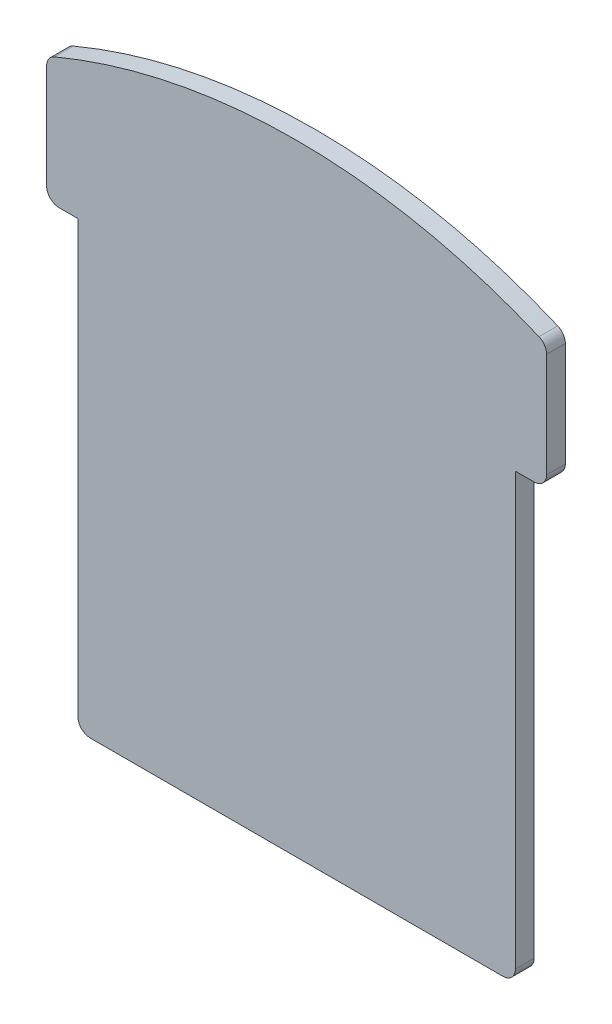
ISO-10303-21;
HEADER;
FILE_DESCRIPTION(('STEP AP214'),'2;1');
FILE_NAME('part.step','',(''),(''),'','','');
FILE_SCHEMA(('AUTOMOTIVE_DESIGN { 1 0 10303 214 1 1 1 1 }'));
ENDSEC;
DATA;
#1=APPLICATION_CONTEXT('core data for automotive mechanical design processes');
#2=APPLICATION_PROTOCOL_DEFINITION('international standard','automotive_design',2000,#1);
#3=PRODUCT_CONTEXT('',#1,'mechanical');
#4=PRODUCT('Part','Part','',(#3));
#5=PRODUCT_RELATED_PRODUCT_CATEGORY('part','',(#4));
#6=PRODUCT_DEFINITION_FORMATION('','',#4);
#7=PRODUCT_DEFINITION_CONTEXT('part definition',#1,'design');
#8=PRODUCT_DEFINITION('design','',#6,#7);
#9=PRODUCT_DEFINITION_SHAPE('','',#8);
#10=(LENGTH_UNIT() NAMED_UNIT(*) SI_UNIT(.MILLI.,.METRE.));
#11=(NAMED_UNIT(*) PLANE_ANGLE_UNIT() SI_UNIT($,.RADIAN.));
#12=(NAMED_UNIT(*) SI_UNIT($,.STERADIAN.) SOLID_ANGLE_UNIT());
#13=UNCERTAINTY_MEASURE_WITH_UNIT(LENGTH_MEASURE(1.E-05),#10,'distance_accuracy_value','');
#14=(GEOMETRIC_REPRESENTATION_CONTEXT(3) GLOBAL_UNCERTAINTY_ASSIGNED_CONTEXT((#13)) GLOBAL_UNIT_ASSIGNED_CONTEXT((#10,
#11,#12)) REPRESENTATION_CONTEXT('',''));
#15=CARTESIAN_POINT('',(0.,0.,0.));
#16=DIRECTION('',(0.,0.,1.));
#17=DIRECTION('',(1.,0.,0.));
#18=AXIS2_PLACEMENT_3D('',#15,#16,#17);
#19=CARTESIAN_POINT('',(0.,0.,3.));
#20=DIRECTION('',(1.,0.,0.));
#21=DIRECTION('',(0.,0.,-1.));
#22=AXIS2_PLACEMENT_3D('',#19,#20,#21);
#23=PLANE('',#22);
#24=DIRECTION('',(0.,-1.,0.));
#25=VECTOR('',#24,1.);
#26=CARTESIAN_POINT('',(0.,0.,0.));
#27=LINE('',#26,#25);
#28=CARTESIAN_POINT('',(0.,71.,0.));
#29=VERTEX_POINT('',#28);
#30=CARTESIAN_POINT('',(0.,2.,0.));
#31=VERTEX_POINT('',#30);
#32=EDGE_CURVE('E187',#29,#31,#27,.T.);
#33=ORIENTED_EDGE('',*,*,#32,.T.);
#34=DIRECTION('',(0.,0.,-1.));
#35=VECTOR('',#34,1.);
#36=CARTESIAN_POINT('',(0.,2.,3.));
#37=LINE('',#36,#35);
#38=CARTESIAN_POINT('',(0.,2.,3.));
#39=VERTEX_POINT('',#38);
#40=EDGE_CURVE('E282',#31,#39,#37,.F.);
#41=ORIENTED_EDGE('',*,*,#40,.T.);
#42=DIRECTION('',(0.,-1.,0.));
#43=VECTOR('',#42,1.);
#44=CARTESIAN_POINT('',(0.,0.,3.));
#45=LINE('',#44,#43);
#46=CARTESIAN_POINT('',(0.,71.,3.));
#47=VERTEX_POINT('',#46);
#48=EDGE_CURVE('E152',#47,#39,#45,.T.);
#49=ORIENTED_EDGE('',*,*,#48,.F.);
#50=DIRECTION('',(0.,0.,-1.));
#51=VECTOR('',#50,1.);
#52=CARTESIAN_POINT('',(0.,71.,3.));
#53=LINE('',#52,#51);
#54=EDGE_CURVE('E165',#47,#29,#53,.T.);
#55=ORIENTED_EDGE('',*,*,#54,.T.);
#56=EDGE_LOOP('',(#33,#41,#49,#55));
#57=FACE_BOUND('',#56,.T.);
#58=ADVANCED_FACE('F39',(#57),#23,.F.);
#59=CARTESIAN_POINT('',(0.,0.,3.));
#60=DIRECTION('',(0.,1.,0.));
#61=DIRECTION('',(0.,0.,1.));
#62=AXIS2_PLACEMENT_3D('',#59,#60,#61);
#63=PLANE('',#62);
#64=DIRECTION('',(1.,0.,0.));
#65=VECTOR('',#64,1.);
#66=CARTESIAN_POINT('',(0.,0.,0.));
#67=LINE('',#66,#65);
#68=CARTESIAN_POINT('',(2.,0.,0.));
#69=VERTEX_POINT('',#68);
#70=CARTESIAN_POINT('',(68.,0.,0.));
#71=VERTEX_POINT('',#70);
#72=EDGE_CURVE('E153',#69,#71,#67,.T.);
#73=ORIENTED_EDGE('',*,*,#72,.T.);
#74=DIRECTION('',(0.,0.,-1.));
#75=VECTOR('',#74,1.);
#76=CARTESIAN_POINT('',(68.,0.,3.));
#77=LINE('',#76,#75);
#78=CARTESIAN_POINT('',(68.,0.,3.));
#79=VERTEX_POINT('',#78);
#80=EDGE_CURVE('E279',#71,#79,#77,.F.);
#81=ORIENTED_EDGE('',*,*,#80,.T.);
#82=DIRECTION('',(1.,0.,0.));
#83=VECTOR('',#82,1.);
#84=CARTESIAN_POINT('',(0.,0.,3.));
#85=LINE('',#84,#83);
#86=CARTESIAN_POINT('',(2.,0.,3.));
#87=VERTEX_POINT('',#86);
#88=EDGE_CURVE('E206',#87,#79,#85,.T.);
#89=ORIENTED_EDGE('',*,*,#88,.F.);
#90=DIRECTION('',(0.,0.,-1.));
#91=VECTOR('',#90,1.);
#92=CARTESIAN_POINT('',(2.,0.,3.));
#93=LINE('',#92,#91);
#94=EDGE_CURVE('E276',#87,#69,#93,.T.);
#95=ORIENTED_EDGE('',*,*,#94,.T.);
#96=EDGE_LOOP('',(#73,#81,#89,#95));
#97=FACE_BOUND('',#96,.T.);
#98=ADVANCED_FACE('F320',(#97),#63,.F.);
#99=CARTESIAN_POINT('',(70.,0.,3.));
#100=DIRECTION('',(-1.,0.,0.));
#101=DIRECTION('',(0.,0.,1.));
#102=AXIS2_PLACEMENT_3D('',#99,#100,#101);
#103=PLANE('',#102);
#104=DIRECTION('',(0.,1.,0.));
#105=VECTOR('',#104,1.);
#106=CARTESIAN_POINT('',(70.,0.,3.));
#107=LINE('',#106,#105);
#108=CARTESIAN_POINT('',(70.,2.,3.));
#109=VERTEX_POINT('',#108);
#110=CARTESIAN_POINT('',(70.,71.,3.));
#111=VERTEX_POINT('',#110);
#112=EDGE_CURVE('E210',#109,#111,#107,.T.);
#113=ORIENTED_EDGE('',*,*,#112,.F.);
#114=DIRECTION('',(0.,0.,-1.));
#115=VECTOR('',#114,1.);
#116=CARTESIAN_POINT('',(70.,2.,3.));
#117=LINE('',#116,#115);
#118=CARTESIAN_POINT('',(70.,2.,0.));
#119=VERTEX_POINT('',#118);
#120=EDGE_CURVE('E149',#109,#119,#117,.T.);
#121=ORIENTED_EDGE('',*,*,#120,.T.);
#122=DIRECTION('',(0.,1.,0.));
#123=VECTOR('',#122,1.);
#124=CARTESIAN_POINT('',(70.,0.,0.));
#125=LINE('',#124,#123);
#126=CARTESIAN_POINT('',(70.,71.,0.));
#127=VERTEX_POINT('',#126);
#128=EDGE_CURVE('E142',#119,#127,#125,.T.);
#129=ORIENTED_EDGE('',*,*,#128,.T.);
#130=DIRECTION('',(0.,0.,-1.));
#131=VECTOR('',#130,1.);
#132=CARTESIAN_POINT('',(70.,71.,3.));
#133=LINE('',#132,#131);
#134=EDGE_CURVE('E146',#111,#127,#133,.T.);
#135=ORIENTED_EDGE('',*,*,#134,.F.);
#136=EDGE_LOOP('',(#113,#121,#129,#135));
#137=FACE_BOUND('',#136,.T.);
#138=ADVANCED_FACE('F145',(#137),#103,.F.);
#139=CARTESIAN_POINT('',(0.,0.,3.));
#140=DIRECTION('',(0.,0.,-1.));
#141=DIRECTION('',(-1.,0.,0.));
#142=AXIS2_PLACEMENT_3D('',#139,#140,#141);
#143=PLANE('',#142);
#144=DIRECTION('',(0.,1.,0.));
#145=VECTOR('',#144,1.);
#146=CARTESIAN_POINT('',(75.,91.,3.));
#147=LINE('',#146,#145);
#148=CARTESIAN_POINT('',(75.,73.,3.));
#149=VERTEX_POINT('',#148);
#150=CARTESIAN_POINT('',(75.,89.6812044259729,3.));
#151=VERTEX_POINT('',#150);
#152=EDGE_CURVE('E199',#149,#151,#147,.T.);
#153=ORIENTED_EDGE('',*,*,#152,.T.);
#154=CARTESIAN_POINT('',(73.,89.6812044259729,3.));
#155=DIRECTION('',(0.,0.,-1.));
#156=DIRECTION('',(-1.,0.,0.));
#157=AXIS2_PLACEMENT_3D('',#154,#155,#156);
#158=CIRCLE('',#157,2.);
#159=CARTESIAN_POINT('',(73.7755102040817,91.5247292897503,3.));
#160=VERTEX_POINT('',#159);
#161=EDGE_CURVE('E242',#151,#160,#158,.F.);
#162=ORIENTED_EDGE('',*,*,#161,.T.);
#163=CARTESIAN_POINT('',(35.,-0.651513899116815,3.));
#164=DIRECTION('',(0.,0.,1.));
#165=DIRECTION('',(-1.,0.,0.));
#166=AXIS2_PLACEMENT_3D('',#163,#164,#165);
#167=CIRCLE('',#166,100.);
#168=CARTESIAN_POINT('',(-3.77551020408164,91.5247292897503,3.));
#169=VERTEX_POINT('',#168);
#170=EDGE_CURVE('E188',#160,#169,#167,.T.);
#171=ORIENTED_EDGE('',*,*,#170,.T.);
#172=CARTESIAN_POINT('',(-3.,89.6812044259729,3.));
#173=DIRECTION('',(0.,0.,-1.));
#174=DIRECTION('',(-1.,0.,0.));
#175=AXIS2_PLACEMENT_3D('',#172,#173,#174);
#176=CIRCLE('',#175,2.);
#177=CARTESIAN_POINT('',(-5.,89.6812044259729,3.));
#178=VERTEX_POINT('',#177);
#179=EDGE_CURVE('E239',#169,#178,#176,.F.);
#180=ORIENTED_EDGE('',*,*,#179,.T.);
#181=DIRECTION('',(0.,-1.,0.));
#182=VECTOR('',#181,1.);
#183=CARTESIAN_POINT('',(-5.,91.,3.));
#184=LINE('',#183,#182);
#185=CARTESIAN_POINT('',(-5.,73.,3.));
#186=VERTEX_POINT('',#185);
#187=EDGE_CURVE('E192',#178,#186,#184,.T.);
#188=ORIENTED_EDGE('',*,*,#187,.T.);
#189=CARTESIAN_POINT('',(-3.,73.,3.));
#190=DIRECTION('',(0.,0.,-1.));
#191=DIRECTION('',(-1.,0.,0.));
#192=AXIS2_PLACEMENT_3D('',#189,#190,#191);
#193=CIRCLE('',#192,2.);
#194=CARTESIAN_POINT('',(-3.,71.,3.));
#195=VERTEX_POINT('',#194);
#196=EDGE_CURVE('E227',#186,#195,#193,.F.);
#197=ORIENTED_EDGE('',*,*,#196,.T.);
#198=DIRECTION('',(1.,0.,0.));
#199=VECTOR('',#198,1.);
#200=CARTESIAN_POINT('',(-5.,71.,3.));
#201=LINE('',#200,#199);
#202=EDGE_CURVE('E196',#195,#47,#201,.T.);
#203=ORIENTED_EDGE('',*,*,#202,.T.);
#204=ORIENTED_EDGE('',*,*,#48,.T.);
#205=CARTESIAN_POINT('',(2.,2.,3.));
#206=DIRECTION('',(0.,0.,-1.));
#207=DIRECTION('',(-1.,0.,0.));
#208=AXIS2_PLACEMENT_3D('',#205,#206,#207);
#209=CIRCLE('',#208,2.);
#210=EDGE_CURVE('E233',#39,#87,#209,.F.);
#211=ORIENTED_EDGE('',*,*,#210,.T.);
#212=ORIENTED_EDGE('',*,*,#88,.T.);
#213=CARTESIAN_POINT('',(68.,2.,3.));
#214=DIRECTION('',(0.,0.,-1.));
#215=DIRECTION('',(-1.,0.,0.));
#216=AXIS2_PLACEMENT_3D('',#213,#214,#215);
#217=CIRCLE('',#216,2.);
#218=EDGE_CURVE('E236',#79,#109,#217,.F.);
#219=ORIENTED_EDGE('',*,*,#218,.T.);
#220=ORIENTED_EDGE('',*,*,#112,.T.);
#221=CARTESIAN_POINT('',(73.,71.,3.));
#222=VERTEX_POINT('',#221);
#223=EDGE_CURVE('E162',#111,#222,#201,.T.);
#224=ORIENTED_EDGE('',*,*,#223,.T.);
#225=CARTESIAN_POINT('',(73.,73.,3.));
#226=DIRECTION('',(0.,0.,-1.));
#227=DIRECTION('',(-1.,0.,0.));
#228=AXIS2_PLACEMENT_3D('',#225,#226,#227);
#229=CIRCLE('',#228,2.);
#230=EDGE_CURVE('E230',#222,#149,#229,.F.);
#231=ORIENTED_EDGE('',*,*,#230,.T.);
#232=EDGE_LOOP('',(#153,#162,#171,#180,#188,#197,#203,#204,#211,#212,#219,#220,#224,#231));
#233=FACE_BOUND('',#232,.T.);
#234=ADVANCED_FACE('F287',(#233),#143,.F.);
#235=CARTESIAN_POINT('',(0.,0.,0.));
#236=DIRECTION('',(0.,0.,-1.));
#237=DIRECTION('',(-1.,0.,0.));
#238=AXIS2_PLACEMENT_3D('',#235,#236,#237);
#239=PLANE('',#238);
#240=CARTESIAN_POINT('',(35.,-0.651513899116815,0.));
#241=DIRECTION('',(0.,0.,1.));
#242=DIRECTION('',(-1.,0.,0.));
#243=AXIS2_PLACEMENT_3D('',#240,#241,#242);
#244=CIRCLE('',#243,100.);
#245=CARTESIAN_POINT('',(73.7755102040817,91.5247292897503,0.));
#246=VERTEX_POINT('',#245);
#247=CARTESIAN_POINT('',(-3.77551020408164,91.5247292897503,0.));
#248=VERTEX_POINT('',#247);
#249=EDGE_CURVE('E180',#246,#248,#244,.T.);
#250=ORIENTED_EDGE('',*,*,#249,.F.);
#251=CARTESIAN_POINT('',(73.,89.6812044259729,0.));
#252=DIRECTION('',(0.,0.,-1.));
#253=DIRECTION('',(-1.,0.,0.));
#254=AXIS2_PLACEMENT_3D('',#251,#252,#253);
#255=CIRCLE('',#254,2.);
#256=CARTESIAN_POINT('',(75.,89.6812044259729,0.));
#257=VERTEX_POINT('',#256);
#258=EDGE_CURVE('E264',#246,#257,#255,.T.);
#259=ORIENTED_EDGE('',*,*,#258,.T.);
#260=DIRECTION('',(0.,1.,0.));
#261=VECTOR('',#260,1.);
#262=CARTESIAN_POINT('',(75.,91.,0.));
#263=LINE('',#262,#261);
#264=CARTESIAN_POINT('',(75.,73.,0.));
#265=VERTEX_POINT('',#264);
#266=EDGE_CURVE('E178',#265,#257,#263,.T.);
#267=ORIENTED_EDGE('',*,*,#266,.F.);
#268=CARTESIAN_POINT('',(73.,73.,0.));
#269=DIRECTION('',(0.,0.,-1.));
#270=DIRECTION('',(-1.,0.,0.));
#271=AXIS2_PLACEMENT_3D('',#268,#269,#270);
#272=CIRCLE('',#271,2.);
#273=CARTESIAN_POINT('',(73.,71.,0.));
#274=VERTEX_POINT('',#273);
#275=EDGE_CURVE('E171',#265,#274,#272,.T.);
#276=ORIENTED_EDGE('',*,*,#275,.T.);
#277=DIRECTION('',(1.,0.,0.));
#278=VECTOR('',#277,1.);
#279=CARTESIAN_POINT('',(-5.,71.,0.));
#280=LINE('',#279,#278);
#281=EDGE_CURVE('E159',#127,#274,#280,.T.);
#282=ORIENTED_EDGE('',*,*,#281,.F.);
#283=ORIENTED_EDGE('',*,*,#128,.F.);
#284=CARTESIAN_POINT('',(68.,2.,0.));
#285=DIRECTION('',(0.,0.,-1.));
#286=DIRECTION('',(-1.,0.,0.));
#287=AXIS2_PLACEMENT_3D('',#284,#285,#286);
#288=CIRCLE('',#287,2.);
#289=EDGE_CURVE('E55',#119,#71,#288,.T.);
#290=ORIENTED_EDGE('',*,*,#289,.T.);
#291=ORIENTED_EDGE('',*,*,#72,.F.);
#292=CARTESIAN_POINT('',(2.,2.,0.));
#293=DIRECTION('',(0.,0.,-1.));
#294=DIRECTION('',(-1.,0.,0.));
#295=AXIS2_PLACEMENT_3D('',#292,#293,#294);
#296=CIRCLE('',#295,2.);
#297=EDGE_CURVE('E63',#69,#31,#296,.T.);
#298=ORIENTED_EDGE('',*,*,#297,.T.);
#299=ORIENTED_EDGE('',*,*,#32,.F.);
#300=CARTESIAN_POINT('',(-3.,71.,0.));
#301=VERTEX_POINT('',#300);
#302=EDGE_CURVE('E173',#301,#29,#280,.T.);
#303=ORIENTED_EDGE('',*,*,#302,.F.);
#304=CARTESIAN_POINT('',(-3.,73.,0.));
#305=DIRECTION('',(0.,0.,-1.));
#306=DIRECTION('',(-1.,0.,0.));
#307=AXIS2_PLACEMENT_3D('',#304,#305,#306);
#308=CIRCLE('',#307,2.);
#309=CARTESIAN_POINT('',(-5.,73.,0.));
#310=VERTEX_POINT('',#309);
#311=EDGE_CURVE('E252',#301,#310,#308,.T.);
#312=ORIENTED_EDGE('',*,*,#311,.T.);
#313=DIRECTION('',(0.,-1.,0.));
#314=VECTOR('',#313,1.);
#315=CARTESIAN_POINT('',(-5.,91.,0.));
#316=LINE('',#315,#314);
#317=CARTESIAN_POINT('',(-5.,89.6812044259729,0.));
#318=VERTEX_POINT('',#317);
#319=EDGE_CURVE('E174',#318,#310,#316,.T.);
#320=ORIENTED_EDGE('',*,*,#319,.F.);
#321=CARTESIAN_POINT('',(-3.,89.6812044259729,0.));
#322=DIRECTION('',(0.,0.,-1.));
#323=DIRECTION('',(-1.,0.,0.));
#324=AXIS2_PLACEMENT_3D('',#321,#322,#323);
#325=CIRCLE('',#324,2.);
#326=EDGE_CURVE('E261',#318,#248,#325,.T.);
#327=ORIENTED_EDGE('',*,*,#326,.T.);
#328=EDGE_LOOP('',(#250,#259,#267,#276,#282,#283,#290,#291,#298,#299,#303,#312,#320,#327));
#329=FACE_BOUND('',#328,.T.);
#330=ADVANCED_FACE('F168',(#329),#239,.T.);
#331=CARTESIAN_POINT('',(-5.,71.,0.));
#332=DIRECTION('',(0.,-1.,0.));
#333=DIRECTION('',(0.,0.,-1.));
#334=AXIS2_PLACEMENT_3D('',#331,#332,#333);
#335=PLANE('',#334);
#336=ORIENTED_EDGE('',*,*,#202,.F.);
#337=DIRECTION('',(0.,0.,1.));
#338=VECTOR('',#337,1.);
#339=CARTESIAN_POINT('',(-3.,71.,0.));
#340=LINE('',#339,#338);
#341=EDGE_CURVE('E11',#195,#301,#340,.F.);
#342=ORIENTED_EDGE('',*,*,#341,.T.);
#343=ORIENTED_EDGE('',*,*,#302,.T.);
#344=ORIENTED_EDGE('',*,*,#54,.F.);
#345=EDGE_LOOP('',(#336,#342,#343,#344));
#346=FACE_BOUND('',#345,.T.);
#347=ADVANCED_FACE('F314',(#346),#335,.T.);
#348=CARTESIAN_POINT('',(35.,-0.651513899116815,0.));
#349=DIRECTION('',(0.,0.,1.));
#350=DIRECTION('',(1.,0.,0.));
#351=AXIS2_PLACEMENT_3D('',#348,#349,#350);
#352=CYLINDRICAL_SURFACE('',#351,100.);
#353=ORIENTED_EDGE('',*,*,#170,.F.);
#354=DIRECTION('',(0.,0.,1.));
#355=VECTOR('',#354,1.);
#356=CARTESIAN_POINT('',(73.7755102040817,91.5247292897503,0.));
#357=LINE('',#356,#355);
#358=EDGE_CURVE('E249',#160,#246,#357,.F.);
#359=ORIENTED_EDGE('',*,*,#358,.T.);
#360=ORIENTED_EDGE('',*,*,#249,.T.);
#361=DIRECTION('',(0.,0.,1.));
#362=VECTOR('',#361,1.);
#363=CARTESIAN_POINT('',(-3.77551020408164,91.5247292897503,0.));
#364=LINE('',#363,#362);
#365=EDGE_CURVE('E245',#248,#169,#364,.T.);
#366=ORIENTED_EDGE('',*,*,#365,.T.);
#367=EDGE_LOOP('',(#353,#359,#360,#366));
#368=FACE_BOUND('',#367,.T.);
#369=ADVANCED_FACE('F295',(#368),#352,.T.);
#370=CARTESIAN_POINT('',(75.,91.,0.));
#371=DIRECTION('',(1.,0.,0.));
#372=DIRECTION('',(0.,0.,-1.));
#373=AXIS2_PLACEMENT_3D('',#370,#371,#372);
#374=PLANE('',#373);
#375=ORIENTED_EDGE('',*,*,#266,.T.);
#376=DIRECTION('',(0.,0.,1.));
#377=VECTOR('',#376,1.);
#378=CARTESIAN_POINT('',(75.,89.6812044259729,0.));
#379=LINE('',#378,#377);
#380=EDGE_CURVE('E223',#257,#151,#379,.T.);
#381=ORIENTED_EDGE('',*,*,#380,.T.);
#382=ORIENTED_EDGE('',*,*,#152,.F.);
#383=DIRECTION('',(0.,0.,1.));
#384=VECTOR('',#383,1.);
#385=CARTESIAN_POINT('',(75.,73.,0.));
#386=LINE('',#385,#384);
#387=EDGE_CURVE('E164',#149,#265,#386,.F.);
#388=ORIENTED_EDGE('',*,*,#387,.T.);
#389=EDGE_LOOP('',(#375,#381,#382,#388));
#390=FACE_BOUND('',#389,.T.);
#391=ADVANCED_FACE('F396',(#390),#374,.T.);
#392=ORIENTED_EDGE('',*,*,#281,.T.);
#393=DIRECTION('',(0.,0.,1.));
#394=VECTOR('',#393,1.);
#395=CARTESIAN_POINT('',(73.,71.,0.));
#396=LINE('',#395,#394);
#397=EDGE_CURVE('E48',#274,#222,#396,.T.);
#398=ORIENTED_EDGE('',*,*,#397,.T.);
#399=ORIENTED_EDGE('',*,*,#223,.F.);
#400=ORIENTED_EDGE('',*,*,#134,.T.);
#401=EDGE_LOOP('',(#392,#398,#399,#400));
#402=FACE_BOUND('',#401,.T.);
#403=ADVANCED_FACE('F157',(#402),#335,.T.);
#404=CARTESIAN_POINT('',(-5.,91.,0.));
#405=DIRECTION('',(-1.,0.,0.));
#406=DIRECTION('',(0.,-1.,0.));
#407=AXIS2_PLACEMENT_3D('',#404,#405,#406);
#408=PLANE('',#407);
#409=ORIENTED_EDGE('',*,*,#187,.F.);
#410=DIRECTION('',(0.,0.,1.));
#411=VECTOR('',#410,1.);
#412=CARTESIAN_POINT('',(-5.,89.6812044259729,0.));
#413=LINE('',#412,#411);
#414=EDGE_CURVE('E271',#178,#318,#413,.F.);
#415=ORIENTED_EDGE('',*,*,#414,.T.);
#416=ORIENTED_EDGE('',*,*,#319,.T.);
#417=DIRECTION('',(0.,0.,1.));
#418=VECTOR('',#417,1.);
#419=CARTESIAN_POINT('',(-5.,73.,0.));
#420=LINE('',#419,#418);
#421=EDGE_CURVE('E267',#310,#186,#420,.T.);
#422=ORIENTED_EDGE('',*,*,#421,.T.);
#423=EDGE_LOOP('',(#409,#415,#416,#422));
#424=FACE_BOUND('',#423,.T.);
#425=ADVANCED_FACE('F304',(#424),#408,.T.);
#426=CARTESIAN_POINT('',(73.,89.6812044259729,0.));
#427=DIRECTION('',(0.,0.,1.));
#428=DIRECTION('',(1.,0.,0.));
#429=AXIS2_PLACEMENT_3D('',#426,#427,#428);
#430=CYLINDRICAL_SURFACE('',#429,2.);
#431=ORIENTED_EDGE('',*,*,#258,.F.);
#432=ORIENTED_EDGE('',*,*,#358,.F.);
#433=ORIENTED_EDGE('',*,*,#161,.F.);
#434=ORIENTED_EDGE('',*,*,#380,.F.);
#435=EDGE_LOOP('',(#431,#432,#433,#434));
#436=FACE_BOUND('',#435,.T.);
#437=ADVANCED_FACE('F343',(#436),#430,.T.);
#438=CARTESIAN_POINT('',(-3.,89.6812044259729,0.));
#439=DIRECTION('',(0.,0.,1.));
#440=DIRECTION('',(1.,0.,0.));
#441=AXIS2_PLACEMENT_3D('',#438,#439,#440);
#442=CYLINDRICAL_SURFACE('',#441,2.);
#443=ORIENTED_EDGE('',*,*,#326,.F.);
#444=ORIENTED_EDGE('',*,*,#414,.F.);
#445=ORIENTED_EDGE('',*,*,#179,.F.);
#446=ORIENTED_EDGE('',*,*,#365,.F.);
#447=EDGE_LOOP('',(#443,#444,#445,#446));
#448=FACE_BOUND('',#447,.T.);
#449=ADVANCED_FACE('F300',(#448),#442,.T.);
#450=CARTESIAN_POINT('',(68.,2.,3.));
#451=DIRECTION('',(0.,0.,-1.));
#452=DIRECTION('',(-1.,0.,0.));
#453=AXIS2_PLACEMENT_3D('',#450,#451,#452);
#454=CYLINDRICAL_SURFACE('',#453,2.);
#455=ORIENTED_EDGE('',*,*,#218,.F.);
#456=ORIENTED_EDGE('',*,*,#80,.F.);
#457=ORIENTED_EDGE('',*,*,#289,.F.);
#458=ORIENTED_EDGE('',*,*,#120,.F.);
#459=EDGE_LOOP('',(#455,#456,#457,#458));
#460=FACE_BOUND('',#459,.T.);
#461=ADVANCED_FACE('F324',(#460),#454,.T.);
#462=CARTESIAN_POINT('',(2.,2.,3.));
#463=DIRECTION('',(0.,0.,-1.));
#464=DIRECTION('',(-1.,0.,0.));
#465=AXIS2_PLACEMENT_3D('',#462,#463,#464);
#466=CYLINDRICAL_SURFACE('',#465,2.);
#467=ORIENTED_EDGE('',*,*,#210,.F.);
#468=ORIENTED_EDGE('',*,*,#40,.F.);
#469=ORIENTED_EDGE('',*,*,#297,.F.);
#470=ORIENTED_EDGE('',*,*,#94,.F.);
#471=EDGE_LOOP('',(#467,#468,#469,#470));
#472=FACE_BOUND('',#471,.T.);
#473=ADVANCED_FACE('F326',(#472),#466,.T.);
#474=CARTESIAN_POINT('',(73.,73.,0.));
#475=DIRECTION('',(0.,0.,1.));
#476=DIRECTION('',(1.,0.,0.));
#477=AXIS2_PLACEMENT_3D('',#474,#475,#476);
#478=CYLINDRICAL_SURFACE('',#477,2.);
#479=ORIENTED_EDGE('',*,*,#275,.F.);
#480=ORIENTED_EDGE('',*,*,#387,.F.);
#481=ORIENTED_EDGE('',*,*,#230,.F.);
#482=ORIENTED_EDGE('',*,*,#397,.F.);
#483=EDGE_LOOP('',(#479,#480,#481,#482));
#484=FACE_BOUND('',#483,.T.);
#485=ADVANCED_FACE('F328',(#484),#478,.T.);
#486=CARTESIAN_POINT('',(-3.,73.,0.));
#487=DIRECTION('',(0.,0.,1.));
#488=DIRECTION('',(1.,0.,0.));
#489=AXIS2_PLACEMENT_3D('',#486,#487,#488);
#490=CYLINDRICAL_SURFACE('',#489,2.);
#491=ORIENTED_EDGE('',*,*,#311,.F.);
#492=ORIENTED_EDGE('',*,*,#341,.F.);
#493=ORIENTED_EDGE('',*,*,#196,.F.);
#494=ORIENTED_EDGE('',*,*,#421,.F.);
#495=EDGE_LOOP('',(#491,#492,#493,#494));
#496=FACE_BOUND('',#495,.T.);
#497=ADVANCED_FACE('F41',(#496),#490,.T.);
#498=CLOSED_SHELL('',(#58,#98,#138,#234,#330,#347,#369,#391,#403,#425,#437,#449,#461,#473,#485,#497));
#499=MANIFOLD_SOLID_BREP('B2',#498);
#500=ADVANCED_BREP_SHAPE_REPRESENTATION('',(#18,#499),#14);
#501=SHAPE_DEFINITION_REPRESENTATION(#9,#500);
ENDSEC;
END-ISO-10303-21;
